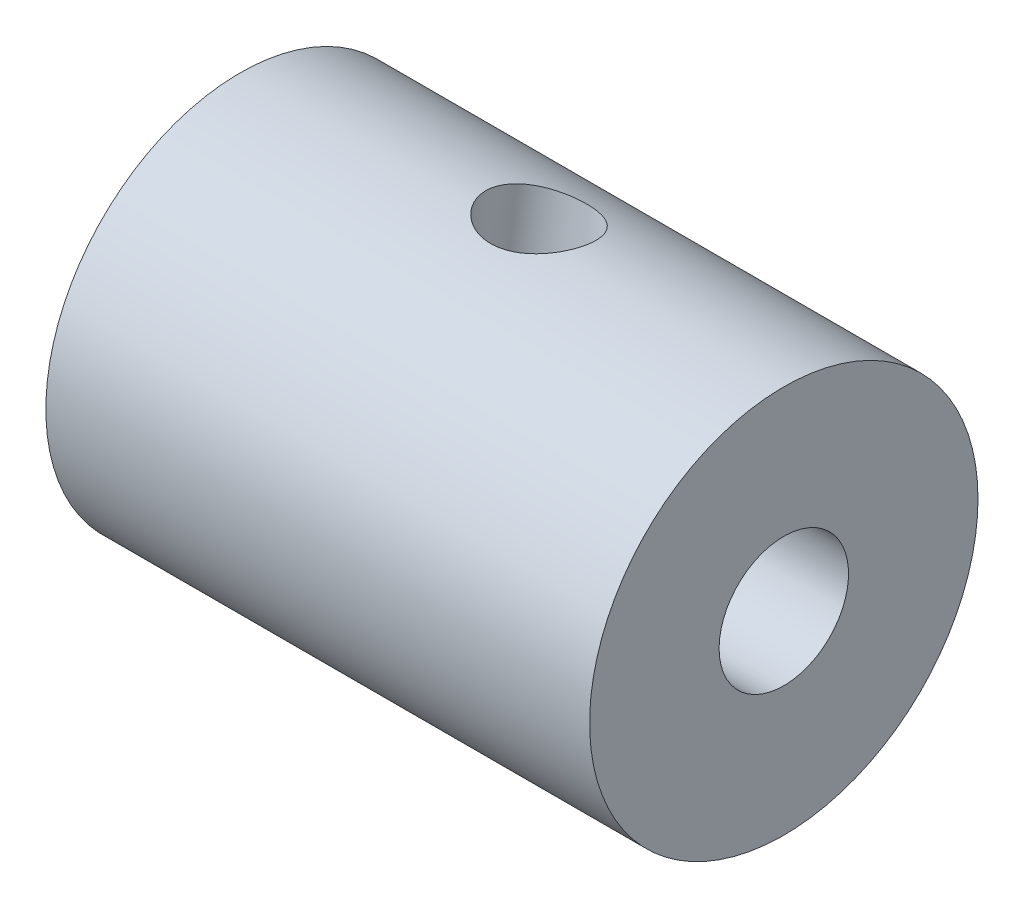
ISO-10303-21;
HEADER;
FILE_DESCRIPTION(('STEP AP214'),'2;1');
FILE_NAME('part.step','',(''),(''),'','','');
FILE_SCHEMA(('AUTOMOTIVE_DESIGN { 1 0 10303 214 1 1 1 1 }'));
ENDSEC;
DATA;
#1=APPLICATION_CONTEXT('core data for automotive mechanical design processes');
#2=APPLICATION_PROTOCOL_DEFINITION('international standard','automotive_design',2000,#1);
#3=PRODUCT_CONTEXT('',#1,'mechanical');
#4=PRODUCT('Part','Part','',(#3));
#5=PRODUCT_RELATED_PRODUCT_CATEGORY('part','',(#4));
#6=PRODUCT_DEFINITION_FORMATION('','',#4);
#7=PRODUCT_DEFINITION_CONTEXT('part definition',#1,'design');
#8=PRODUCT_DEFINITION('design','',#6,#7);
#9=PRODUCT_DEFINITION_SHAPE('','',#8);
#10=(LENGTH_UNIT() NAMED_UNIT(*) SI_UNIT(.MILLI.,.METRE.));
#11=(NAMED_UNIT(*) PLANE_ANGLE_UNIT() SI_UNIT($,.RADIAN.));
#12=(NAMED_UNIT(*) SI_UNIT($,.STERADIAN.) SOLID_ANGLE_UNIT());
#13=UNCERTAINTY_MEASURE_WITH_UNIT(LENGTH_MEASURE(1.E-05),#10,'distance_accuracy_value','');
#14=(GEOMETRIC_REPRESENTATION_CONTEXT(3) GLOBAL_UNCERTAINTY_ASSIGNED_CONTEXT((#13)) GLOBAL_UNIT_ASSIGNED_CONTEXT((#10,
#11,#12)) REPRESENTATION_CONTEXT('',''));
#15=CARTESIAN_POINT('',(0.,0.,0.));
#16=DIRECTION('',(0.,0.,1.));
#17=DIRECTION('',(1.,0.,0.));
#18=AXIS2_PLACEMENT_3D('',#15,#16,#17);
#19=CARTESIAN_POINT('',(-77.7999999999986,709.260912286206,-417.857743681072));
#20=DIRECTION('',(-1.,0.,0.));
#21=DIRECTION('',(0.,0.,1.));
#22=AXIS2_PLACEMENT_3D('',#19,#20,#21);
#23=CYLINDRICAL_SURFACE('',#22,0.999999999999928);
#24=CARTESIAN_POINT('',(-77.7999999999986,709.260912286206,-417.857743681072));
#25=DIRECTION('',(-1.,0.,0.));
#26=DIRECTION('',(0.,0.,1.));
#27=AXIS2_PLACEMENT_3D('',#24,#25,#26);
#28=CIRCLE('',#27,0.999999999999928);
#29=CARTESIAN_POINT('',(-77.7999999999986,709.260912286206,-416.857743681072));
#30=VERTEX_POINT('',#29);
#31=EDGE_CURVE('E70',#30,#30,#28,.T.);
#32=ORIENTED_EDGE('',*,*,#31,.F.);
#33=EDGE_LOOP('',(#32));
#34=FACE_BOUND('',#33,.T.);
#35=CARTESIAN_POINT('',(-81.2499999999986,708.27101270587,-417.715973370885));
#36=CARTESIAN_POINT('',(-81.2500048845507,708.276207997283,-417.679730081788));
#37=CARTESIAN_POINT('',(-81.2527028403196,708.283412885975,-417.64372410393));
#38=CARTESIAN_POINT('',(-81.2633318807978,708.301499896406,-417.573393158187));
#39=CARTESIAN_POINT('',(-81.2712767691582,708.312391680702,-417.539072881622));
#40=CARTESIAN_POINT('',(-81.2918568135323,708.33710976115,-417.473274282663));
#41=CARTESIAN_POINT('',(-81.304463249926,708.350917871078,-417.441779995941));
#42=CARTESIAN_POINT('',(-81.3337717143092,708.380724270285,-417.38194121829));
#43=CARTESIAN_POINT('',(-81.3504723997277,708.396721840846,-417.353595699248));
#44=CARTESIAN_POINT('',(-81.3891314254881,708.431673143965,-417.297793605723));
#45=CARTESIAN_POINT('',(-81.4114334597181,708.45076344167,-417.270662515316));
#46=CARTESIAN_POINT('',(-81.4597476714206,708.489636242297,-417.220449361895));
#47=CARTESIAN_POINT('',(-81.4857656108342,708.509419783533,-417.197373713631));
#48=CARTESIAN_POINT('',(-81.5467915096183,708.552597477789,-417.151001440495));
#49=CARTESIAN_POINT('',(-81.5825519064802,708.575908306867,-417.128612987354));
#50=CARTESIAN_POINT('',(-81.6587255820783,708.619753626098,-417.089779633551));
#51=CARTESIAN_POINT('',(-81.699132388585,708.640291893588,-417.073326594281));
#52=CARTESIAN_POINT('',(-81.7697514249272,708.669376807342,-417.051333288142));
#53=CARTESIAN_POINT('',(-81.79869536009,708.679618924349,-417.043985869656));
#54=CARTESIAN_POINT('',(-81.8581963795789,708.696380139565,-417.032268775681));
#55=CARTESIAN_POINT('',(-81.8887495951812,708.702907757833,-417.027892281203));
#56=CARTESIAN_POINT('',(-81.9510912641388,708.711280253198,-417.022319939194));
#57=CARTESIAN_POINT('',(-81.9828883451079,708.713082559864,-417.021153002059));
#58=CARTESIAN_POINT('',(-82.0463073975172,708.711524256042,-417.022176115647));
#59=CARTESIAN_POINT('',(-82.0779293017384,708.708161785143,-417.02436737603));
#60=CARTESIAN_POINT('',(-82.1365957174613,708.697515196412,-417.031536976128));
#61=CARTESIAN_POINT('',(-82.1637682712989,708.690688553605,-417.03619245829));
#62=CARTESIAN_POINT('',(-82.216719520876,708.674232837157,-417.047861474921));
#63=CARTESIAN_POINT('',(-82.2424968536256,708.664601079775,-417.054877268577));
#64=CARTESIAN_POINT('',(-82.3081283443234,708.63669974189,-417.076189582305));
#65=CARTESIAN_POINT('',(-82.3467004939664,708.616795944951,-417.092295127816));
#66=CARTESIAN_POINT('',(-82.4195985205639,708.574486562594,-417.129988351715));
#67=CARTESIAN_POINT('',(-82.4539137989757,708.552074986977,-417.151589320361));
#68=CARTESIAN_POINT('',(-82.5188742353395,708.506160493196,-417.200847149261));
#69=CARTESIAN_POINT('',(-82.5494057164576,708.482644301465,-417.228642346256));
#70=CARTESIAN_POINT('',(-82.6051280733627,708.436845520409,-417.289964334865));
#71=CARTESIAN_POINT('',(-82.6303283864811,708.414560803674,-417.323480805203));
#72=CARTESIAN_POINT('',(-82.6699986312418,708.377067693497,-417.388766391233));
#73=CARTESIAN_POINT('',(-82.6856067770826,708.361335854256,-417.419541595384));
#74=CARTESIAN_POINT('',(-82.7121230026604,708.332617442938,-417.484227453326));
#75=CARTESIAN_POINT('',(-82.7230384110854,708.319626606491,-417.518133116901));
#76=CARTESIAN_POINT('',(-82.7374579930122,708.300057549694,-417.579333934648));
#77=CARTESIAN_POINT('',(-82.7421434608892,708.292688986344,-417.606103039053));
#78=CARTESIAN_POINT('',(-82.7484153705992,708.28015788407,-417.660512496051));
#79=CARTESIAN_POINT('',(-82.7500016622642,708.274995452052,-417.688152890795));
#80=CARTESIAN_POINT('',(-82.7499978315725,708.265817212014,-417.752265197374));
#81=CARTESIAN_POINT('',(-82.7472934082658,708.262629214563,-417.788863478914));
#82=CARTESIAN_POINT('',(-82.7366544341147,708.260258086652,-417.861433438673));
#83=CARTESIAN_POINT('',(-82.7287146197777,708.261078991941,-417.897404448858));
#84=CARTESIAN_POINT('',(-82.7081452962362,708.266331987111,-417.967463110696));
#85=CARTESIAN_POINT('',(-82.6955415131832,708.270744423588,-418.001559936824));
#86=CARTESIAN_POINT('',(-82.6662344673994,708.282556401723,-418.067359536654));
#87=CARTESIAN_POINT('',(-82.6495310211331,708.289956077125,-418.099062203091));
#88=CARTESIAN_POINT('',(-82.6108678261683,708.307841970999,-418.162438317533));
#89=CARTESIAN_POINT('',(-82.5885648827799,708.318550306374,-418.193838063676));
#90=CARTESIAN_POINT('',(-82.5402502957325,708.341766981028,-418.252943106282));
#91=CARTESIAN_POINT('',(-82.5142331701942,708.354277981177,-418.280642822657));
#92=CARTESIAN_POINT('',(-82.4532117660105,708.382702555651,-418.337266229201));
#93=CARTESIAN_POINT('',(-82.4174554953008,708.398791010154,-418.365295256726));
#94=CARTESIAN_POINT('',(-82.3412811344146,708.429974081354,-418.414874970212));
#95=CARTESIAN_POINT('',(-82.3008686515711,708.445069859775,-418.436433338043));
#96=CARTESIAN_POINT('',(-82.2299734980261,708.466900223156,-418.465823093375));
#97=CARTESIAN_POINT('',(-82.2007376052727,708.474737748683,-418.475831946807));
#98=CARTESIAN_POINT('',(-82.1406402028206,708.487597866375,-418.491851157142));
#99=CARTESIAN_POINT('',(-82.1097850732087,708.492630714189,-418.497876097004));
#100=CARTESIAN_POINT('',(-82.0655214327794,708.497138113137,-418.503229973255));
#101=CARTESIAN_POINT('',(-82.0524693465091,708.498141842945,-418.504414123985));
#102=CARTESIAN_POINT('',(-82.0262810227931,708.499488212035,-418.505998362604));
#103=CARTESIAN_POINT('',(-82.0131447630282,708.499830668025,-418.506398233107));
#104=CARTESIAN_POINT('',(-81.9650341732786,708.499819165988,-418.506390500157));
#105=CARTESIAN_POINT('',(-81.9300081782554,708.497365383375,-418.503540483813));
#106=CARTESIAN_POINT('',(-81.8613543700137,708.488170402613,-418.49250016541));
#107=CARTESIAN_POINT('',(-81.8277322412017,708.481413293182,-418.484290041845));
#108=CARTESIAN_POINT('',(-81.7632095114858,708.465125445836,-418.463461345449));
#109=CARTESIAN_POINT('',(-81.732277226604,708.455635150856,-418.450906550532));
#110=CARTESIAN_POINT('',(-81.6728234327272,708.435139488555,-418.422024596851));
#111=CARTESIAN_POINT('',(-81.6443013420605,708.424134488486,-418.405698351853));
#112=CARTESIAN_POINT('',(-81.5839430764651,708.39927799166,-418.365921497186));
#113=CARTESIAN_POINT('',(-81.5526648176567,708.385313242696,-418.341694883806));
#114=CARTESIAN_POINT('',(-81.4937361291908,708.358080162472,-418.288769305694));
#115=CARTESIAN_POINT('',(-81.4660910010762,708.344812865509,-418.260063936081));
#116=CARTESIAN_POINT('',(-81.4095775010856,708.317659195234,-418.192209657688));
#117=CARTESIAN_POINT('',(-81.3816094302927,708.304198358577,-418.152124789363));
#118=CARTESIAN_POINT('',(-81.3326983488309,708.281995756834,-418.066686304748));
#119=CARTESIAN_POINT('',(-81.3117418987073,708.273244944021,-418.021342994903));
#120=CARTESIAN_POINT('',(-81.283387951575,708.263840174564,-417.941145563671));
#121=CARTESIAN_POINT('',(-81.2738076237142,708.261541108672,-417.907247034778));
#122=CARTESIAN_POINT('',(-81.25930445421,708.260511919089,-417.838469828234));
#123=CARTESIAN_POINT('',(-81.2543676684105,708.261771064499,-417.803594411024));
#124=CARTESIAN_POINT('',(-81.2506269369177,708.2664518331,-417.751134776349));
#125=CARTESIAN_POINT('',(-81.2499976343768,708.268496590864,-417.733526242575));
#126=CARTESIAN_POINT('',(-81.2499999999986,708.27101270587,-417.715973370885));
#127=B_SPLINE_CURVE_WITH_KNOTS('',3,(#35,#36,#37,#38,#39,#40,#41,#42,#43,#44,#45,#46,#47,#48,
#49,#50,#51,#52,#53,#54,#55,#56,#57,#58,#59,#60,#61,#62,#63,#64,#65,#66,#67,#68,#69,#70,#71,#72,
#73,#74,#75,#76,#77,#78,#79,#80,#81,#82,#83,#84,#85,#86,#87,#88,#89,#90,#91,#92,#93,#94,#95,#96,
#97,#98,#99,#100,#101,#102,#103,#104,#105,#106,#107,#108,#109,#110,#111,#112,#113,#114,#115,
#116,#117,#118,#119,#120,#121,#122,#123,#124,#125,#126),.UNSPECIFIED.,.T.,.F.,(4,2,2,2,2,2,2,2,
2,2,2,2,2,2,2,2,2,2,2,2,2,2,2,2,2,2,2,2,2,2,2,2,2,2,2,2,2,2,2,2,2,2,2,2,2,4),(0.,
0.10977909861095,0.219848161168952,0.329250094068512,0.438616200162933,0.558111599137529,
0.677794342893345,0.821800215780328,0.965607871232492,1.05999761233454,1.15416996693877,
1.24918785242927,1.34423997247256,1.42913458582805,1.51411068885052,1.65224717459528,
1.7907209623771,1.93266884602551,2.07436330844395,2.18768580001658,2.30083066627396,
2.38504944966747,2.46927231371258,2.57914107077497,2.68912045508973,2.79850202951172,
2.9078885016643,3.0273884559494,3.14706664334592,3.29105921757442,3.43488016359609,
3.53020422074185,3.62517738737275,3.66457445599727,3.70398244311206,3.80880995850965,
3.91402733535224,4.01776145273725,4.12147046320083,4.24691101470579,4.3725326260611,
4.52377308917047,4.67472198031441,4.7801931746735,4.88534662738972,4.9385133923331),.UNSPECIFIED.);
#128=CARTESIAN_POINT('',(-81.2499999999986,708.27101270587,-417.715973370885));
#129=VERTEX_POINT('',#128);
#130=EDGE_CURVE('E19',#129,#129,#127,.T.);
#131=ORIENTED_EDGE('',*,*,#130,.T.);
#132=EDGE_LOOP('',(#131));
#133=FACE_BOUND('',#132,.T.);
#134=CARTESIAN_POINT('',(-86.1999999999986,709.260912286206,-417.857743681072));
#135=DIRECTION('',(-1.,0.,0.));
#136=DIRECTION('',(0.,0.,1.));
#137=AXIS2_PLACEMENT_3D('',#134,#135,#136);
#138=CIRCLE('',#137,0.999999999999928);
#139=CARTESIAN_POINT('',(-86.1999999999986,709.260912286206,-416.857743681072));
#140=VERTEX_POINT('',#139);
#141=EDGE_CURVE('E54',#140,#140,#138,.F.);
#142=ORIENTED_EDGE('',*,*,#141,.F.);
#143=EDGE_LOOP('',(#142));
#144=FACE_BOUND('',#143,.T.);
#145=CARTESIAN_POINT('',(-81.9999999999987,709.80934158169,-418.693940612335));
#146=CARTESIAN_POINT('',(-82.0349658267189,709.80935118256,-418.693937564401));
#147=CARTESIAN_POINT('',(-82.0699918217421,709.812506262199,-418.6918908317));
#148=CARTESIAN_POINT('',(-82.1386456299838,709.824430387009,-418.683875125296));
#149=CARTESIAN_POINT('',(-82.1722677587958,709.833220267302,-418.677891592791));
#150=CARTESIAN_POINT('',(-82.2367904885117,709.854699512223,-418.662471780782));
#151=CARTESIAN_POINT('',(-82.2677227733935,709.867332158648,-418.65308536408));
#152=CARTESIAN_POINT('',(-82.3271765672703,709.895110436296,-418.631117052526));
#153=CARTESIAN_POINT('',(-82.3556986579369,709.910255458556,-418.61853593163));
#154=CARTESIAN_POINT('',(-82.4160569235324,709.945277220769,-418.58733465324));
#155=CARTESIAN_POINT('',(-82.4473351823409,709.965480466649,-418.568001472814));
#156=CARTESIAN_POINT('',(-82.5062638708068,710.006473820058,-418.524847070336));
#157=CARTESIAN_POINT('',(-82.5339089989214,710.027264732567,-418.50101941056));
#158=CARTESIAN_POINT('',(-82.5904224989118,710.072372007063,-418.44351411782));
#159=CARTESIAN_POINT('',(-82.6183905697048,710.096542640041,-418.408818710435));
#160=CARTESIAN_POINT('',(-82.6673016511665,710.141833344982,-418.333046405314));
#161=CARTESIAN_POINT('',(-82.6882581012901,710.162959208195,-418.291981939214));
#162=CARTESIAN_POINT('',(-82.7166120484223,710.194495481744,-418.21764795563));
#163=CARTESIAN_POINT('',(-82.7261923762831,710.206216659227,-418.185757361978));
#164=CARTESIAN_POINT('',(-82.7406955457874,710.226508640011,-418.120033706518));
#165=CARTESIAN_POINT('',(-82.7456323315868,710.235088827725,-418.086206786002));
#166=CARTESIAN_POINT('',(-82.7493730630796,710.245320414284,-418.03454212205));
#167=CARTESIAN_POINT('',(-82.7500023656205,710.248300156835,-418.017067493862));
#168=CARTESIAN_POINT('',(-82.7499951154467,710.255998061863,-417.963269399448));
#169=CARTESIAN_POINT('',(-82.7472971596778,710.259188833231,-417.926688532309));
#170=CARTESIAN_POINT('',(-82.7366681191997,710.261569138616,-417.854108121579));
#171=CARTESIAN_POINT('',(-82.7287232308392,710.260748081742,-417.818110368674));
#172=CARTESIAN_POINT('',(-82.7081431864652,710.255491746162,-417.748018927954));
#173=CARTESIAN_POINT('',(-82.6955367500716,710.25107840345,-417.713915021989));
#174=CARTESIAN_POINT('',(-82.6662282856885,710.239265504303,-417.648115659088));
#175=CARTESIAN_POINT('',(-82.64952760027,710.231866926261,-417.616419417094));
#176=CARTESIAN_POINT('',(-82.6108685745097,710.21398293286,-417.553050418273));
#177=CARTESIAN_POINT('',(-82.5885665402797,710.20327508614,-417.52165173117));
#178=CARTESIAN_POINT('',(-82.5402523285773,710.180058544688,-417.462546337101));
#179=CARTESIAN_POINT('',(-82.5142343891638,710.167547052908,-417.434845495596));
#180=CARTESIAN_POINT('',(-82.4532084903797,710.139120618638,-417.378218303968));
#181=CARTESIAN_POINT('',(-82.4174480935179,710.123030747981,-417.350187006306));
#182=CARTESIAN_POINT('',(-82.3412744179199,710.091847526374,-417.30060830043));
#183=CARTESIAN_POINT('',(-82.3008676114133,710.076752834245,-417.27905202055));
#184=CARTESIAN_POINT('',(-82.2302485750711,710.055010074928,-417.249779334643));
#185=CARTESIAN_POINT('',(-82.2013046399082,710.047241916346,-417.239852541029));
#186=CARTESIAN_POINT('',(-82.1418036204193,710.034443178206,-417.223901963335));
#187=CARTESIAN_POINT('',(-82.1112504048171,710.029406335006,-417.217869242992));
#188=CARTESIAN_POINT('',(-82.0489087358594,710.022934421005,-417.210170931276));
#189=CARTESIAN_POINT('',(-82.0171116548903,710.021532094929,-417.2085450367));
#190=CARTESIAN_POINT('',(-81.9536926024809,710.022740594424,-417.209964403173));
#191=CARTESIAN_POINT('',(-81.9220706982597,710.0253528661,-417.213011347431));
#192=CARTESIAN_POINT('',(-81.8634042825367,710.03355914708,-417.222880996342));
#193=CARTESIAN_POINT('',(-81.836231728699,710.038804689385,-417.229265418956));
#194=CARTESIAN_POINT('',(-81.7832804791219,710.051323703279,-417.245084105503));
#195=CARTESIAN_POINT('',(-81.7575031463724,710.058599116629,-417.254521291072));
#196=CARTESIAN_POINT('',(-81.6918716556746,710.079397015768,-417.282808156639));
#197=CARTESIAN_POINT('',(-81.6532995060315,710.093980274981,-417.303852830063));
#198=CARTESIAN_POINT('',(-81.5804014794341,710.124009308699,-417.351906134811));
#199=CARTESIAN_POINT('',(-81.5460862010222,710.139457102345,-417.378929203467));
#200=CARTESIAN_POINT('',(-81.4811257646585,710.169700414866,-417.439094114294));
#201=CARTESIAN_POINT('',(-81.4505942835403,710.184469845836,-417.472372457978));
#202=CARTESIAN_POINT('',(-81.3948719266352,710.211215967979,-417.544084099874));
#203=CARTESIAN_POINT('',(-81.3696716135168,710.223197597988,-417.582508088816));
#204=CARTESIAN_POINT('',(-81.330001368756,710.240859428028,-417.65569279223));
#205=CARTESIAN_POINT('',(-81.3143932229151,710.247321000422,-417.689646467121));
#206=CARTESIAN_POINT('',(-81.2878769973372,710.256729183529,-417.75979269622));
#207=CARTESIAN_POINT('',(-81.2769615889122,710.25968128783,-417.795981657718));
#208=CARTESIAN_POINT('',(-81.2625420069852,710.261286068614,-417.86021492601));
#209=CARTESIAN_POINT('',(-81.2578565391082,710.260844968108,-417.887976159896));
#210=CARTESIAN_POINT('',(-81.2515846293981,710.257600880547,-417.943715673985));
#211=CARTESIAN_POINT('',(-81.2499983377331,710.254797779052,-417.971693964641));
#212=CARTESIAN_POINT('',(-81.2500021684249,710.24561224221,-418.035805226194));
#213=CARTESIAN_POINT('',(-81.2527065917316,710.238399803289,-418.071827139861));
#214=CARTESIAN_POINT('',(-81.2633455658827,710.22030691764,-418.142145478835));
#215=CARTESIAN_POINT('',(-81.2712853802198,710.209422784895,-418.176440130219));
#216=CARTESIAN_POINT('',(-81.2918547037614,710.184717110851,-418.242208205506));
#217=CARTESIAN_POINT('',(-81.3044584868143,710.170911857875,-418.273695951343));
#218=CARTESIAN_POINT('',(-81.3337655325983,710.141106276157,-418.333535214905));
#219=CARTESIAN_POINT('',(-81.3504689788646,710.125105849156,-418.361886592139));
#220=CARTESIAN_POINT('',(-81.3891321738294,710.090150724769,-418.417694981836));
#221=CARTESIAN_POINT('',(-81.4114351172179,710.071059660804,-418.444826951557));
#222=CARTESIAN_POINT('',(-81.4597497042654,710.032186830976,-418.495039730257));
#223=CARTESIAN_POINT('',(-81.4857668298037,710.012404077407,-418.518114436608));
#224=CARTESIAN_POINT('',(-81.5467882339875,709.969229230573,-418.564483598813));
#225=CARTESIAN_POINT('',(-81.5825445046973,709.945920397897,-418.586870270553));
#226=CARTESIAN_POINT('',(-81.6587188655836,709.902074940214,-418.625704633678));
#227=CARTESIAN_POINT('',(-81.6991313484272,709.881535044058,-418.642159372072));
#228=CARTESIAN_POINT('',(-81.7700265019722,709.852333189054,-418.664240453298));
#229=CARTESIAN_POINT('',(-81.7992623947257,709.842001461206,-418.671647163302));
#230=CARTESIAN_POINT('',(-81.8593597971777,709.825162070166,-418.683412903236));
#231=CARTESIAN_POINT('',(-81.8902149267895,709.818640470479,-418.687783051401));
#232=CARTESIAN_POINT('',(-81.9344785672187,709.812811549801,-418.691656592404));
#233=CARTESIAN_POINT('',(-81.9475306534889,709.811515803995,-418.692511419456));
#234=CARTESIAN_POINT('',(-81.9737189772048,709.809778896835,-418.69365408093));
#235=CARTESIAN_POINT('',(-81.9868552369695,709.809337972419,-418.693941758151));
#236=CARTESIAN_POINT('',(-81.9999999999987,709.80934158169,-418.693940612335));
#237=B_SPLINE_CURVE_WITH_KNOTS('',3,(#145,#146,#147,#148,#149,#150,#151,#152,#153,#154,#155,
#156,#157,#158,#159,#160,#161,#162,#163,#164,#165,#166,#167,#168,#169,#170,#171,#172,#173,#174,
#175,#176,#177,#178,#179,#180,#181,#182,#183,#184,#185,#186,#187,#188,#189,#190,#191,#192,#193,
#194,#195,#196,#197,#198,#199,#200,#201,#202,#203,#204,#205,#206,#207,#208,#209,#210,#211,#212,
#213,#214,#215,#216,#217,#218,#219,#220,#221,#222,#223,#224,#225,#226,#227,#228,#229,#230,#231,
#232,#233,#234,#235,#236),.UNSPECIFIED.,.T.,.F.,(4,2,2,2,2,2,2,2,2,2,2,2,2,2,2,2,2,2,2,2,2,2,2,
2,2,2,2,2,2,2,2,2,2,2,2,2,2,2,2,2,2,2,2,2,2,4),(0.,0.104827515397535,0.21004489224005,
0.313779009625065,0.417488020088701,0.542928571593843,0.668550182949094,0.819790646058455,
0.97073953720227,1.07621073156133,1.18136418427751,1.23453094922017,1.34431004783097,
1.45437911038896,1.56378104328848,1.67314714938292,1.79264254835743,1.91232529211317,
2.05633116500008,2.20013882045222,2.29452856155441,2.38870091615867,2.48371880164926,
2.57877092169268,2.66366553504821,2.74864163807062,2.88677812381533,3.02525191159701,
3.16719979524538,3.30889425766379,3.42221674923636,3.53536161549401,3.61958039888825,
3.70380326293407,3.81367201999647,3.9236514043113,4.03303297873331,4.14241945088583,
4.26191940517105,4.38159759256774,4.52559016679625,4.66941111281807,4.76473516996373,
4.85970833659449,4.89910540521868,4.93851339233312),.UNSPECIFIED.);
#238=CARTESIAN_POINT('',(-81.9999999999987,709.80934158169,-418.693940612335));
#239=VERTEX_POINT('',#238);
#240=EDGE_CURVE('E65',#239,#239,#237,.T.);
#241=ORIENTED_EDGE('',*,*,#240,.T.);
#242=EDGE_LOOP('',(#241));
#243=FACE_BOUND('',#242,.T.);
#244=ADVANCED_FACE('F15',(#34,#133,#144,#243),#23,.F.);
#245=CARTESIAN_POINT('',(-81.9999999999987,706.188551002081,-417.417729743387));
#246=DIRECTION('',(0.,0.989899580336078,-0.141770310186783));
#247=DIRECTION('',(0.,0.141770310186783,0.989899580336078));
#248=AXIS2_PLACEMENT_3D('',#245,#246,#247);
#249=CYLINDRICAL_SURFACE('',#248,0.749999999999979);
#250=CARTESIAN_POINT('',(-81.9999999999987,706.279186111771,-418.188362828568));
#251=CARTESIAN_POINT('',(-82.0414272520417,706.279185716028,-418.188362061246));
#252=CARTESIAN_POINT('',(-82.0828622086163,706.278787694996,-418.184827510478));
#253=CARTESIAN_POINT('',(-82.1645288235234,706.27728479915,-418.170817768395));
#254=CARTESIAN_POINT('',(-82.20476032834,706.276179834555,-418.160341695511));
#255=CARTESIAN_POINT('',(-82.2792922132981,706.273641912033,-418.134096704128));
#256=CARTESIAN_POINT('',(-82.3137979806835,706.27224839372,-418.118902198232));
#257=CARTESIAN_POINT('',(-82.3801377331413,706.269367566374,-418.083519403028));
#258=CARTESIAN_POINT('',(-82.4119716413379,706.267880254645,-418.0633309701));
#259=CARTESIAN_POINT('',(-82.4763213142916,706.264953233024,-418.015466650797));
#260=CARTESIAN_POINT('',(-82.5083659608642,706.263546088942,-417.987152401972));
#261=CARTESIAN_POINT('',(-82.567334607976,706.261521110845,-417.925568356241));
#262=CARTESIAN_POINT('',(-82.5942558371405,706.260903702989,-417.892295894574));
#263=CARTESIAN_POINT('',(-82.6422374918772,706.260921049558,-417.821721582112));
#264=CARTESIAN_POINT('',(-82.6632932448471,706.261556799047,-417.784416551508));
#265=CARTESIAN_POINT('',(-82.6988639914202,706.264457210297,-417.70689297275));
#266=CARTESIAN_POINT('',(-82.7133852940268,706.266720295359,-417.666677278585));
#267=CARTESIAN_POINT('',(-82.7328820713023,706.272356049393,-417.594043858255));
#268=CARTESIAN_POINT('',(-82.7392884367597,706.275351129897,-417.561973324736));
#269=CARTESIAN_POINT('',(-82.7478478938913,706.28245616313,-417.497390656318));
#270=CARTESIAN_POINT('',(-82.7500011312827,706.286566077657,-417.464878536588));
#271=CARTESIAN_POINT('',(-82.7499985699585,706.297088343376,-417.391418489891));
#272=CARTESIAN_POINT('',(-82.746554645867,706.303822104587,-417.350510224689));
#273=CARTESIAN_POINT('',(-82.7328889446098,706.318744880082,-417.270098185794));
#274=CARTESIAN_POINT('',(-82.7226623667921,706.32693492209,-417.230595427777));
#275=CARTESIAN_POINT('',(-82.6957801548835,706.344325471881,-417.154140720034));
#276=CARTESIAN_POINT('',(-82.6791326019995,706.353524699168,-417.11718563254));
#277=CARTESIAN_POINT('',(-82.63990864234,706.372391180349,-417.046708218504));
#278=CARTESIAN_POINT('',(-82.6173322104889,706.382058436222,-417.013185906481));
#279=CARTESIAN_POINT('',(-82.5663996733794,706.401415344908,-416.949780238653));
#280=CARTESIAN_POINT('',(-82.5379443656925,706.411102103089,-416.919975681735));
#281=CARTESIAN_POINT('',(-82.4762740767429,706.429624144188,-416.865454214663));
#282=CARTESIAN_POINT('',(-82.4430585332362,706.438459326318,-416.840737906337));
#283=CARTESIAN_POINT('',(-82.3722023557579,706.454722218661,-416.796678753201));
#284=CARTESIAN_POINT('',(-82.3345033196691,706.462127072614,-416.777421180225));
#285=CARTESIAN_POINT('',(-82.2561257242371,706.474733068167,-416.745311681383));
#286=CARTESIAN_POINT('',(-82.2154476475651,706.479934565838,-416.73245872045));
#287=CARTESIAN_POINT('',(-82.1331282850799,706.487584482617,-416.713735767824));
#288=CARTESIAN_POINT('',(-82.091522621847,706.490085968289,-416.707731040378));
#289=CARTESIAN_POINT('',(-82.0078157860766,706.492289664552,-416.702435204214));
#290=CARTESIAN_POINT('',(-81.965714694416,706.491992325878,-416.703143014476));
#291=CARTESIAN_POINT('',(-81.8832922193732,706.488668738536,-416.711147474895));
#292=CARTESIAN_POINT('',(-81.8429524339362,706.485708817713,-416.718283985158));
#293=CARTESIAN_POINT('',(-81.7641197085238,706.477409854328,-416.738710800959));
#294=CARTESIAN_POINT('',(-81.7256269115457,706.472070627883,-416.752001582127));
#295=CARTESIAN_POINT('',(-81.6511297374287,706.459388889712,-416.784536824142));
#296=CARTESIAN_POINT('',(-81.6151545022293,706.452026641743,-416.803840204484));
#297=CARTESIAN_POINT('',(-81.5470384802865,706.435900492081,-416.847864307528));
#298=CARTESIAN_POINT('',(-81.5148981085602,706.427136438921,-416.872585615752));
#299=CARTESIAN_POINT('',(-81.4544043291214,706.408585862155,-416.927636354256));
#300=CARTESIAN_POINT('',(-81.4261840782213,706.39877739871,-416.95810487906));
#301=CARTESIAN_POINT('',(-81.3753983818202,706.379056595207,-417.023435473374));
#302=CARTESIAN_POINT('',(-81.3528353701155,706.369144212345,-417.058299424177));
#303=CARTESIAN_POINT('',(-81.3139563120141,706.349850243332,-417.131683870905));
#304=CARTESIAN_POINT('',(-81.2976668279197,706.340471054421,-417.170219071183));
#305=CARTESIAN_POINT('',(-81.2720228750061,706.322891636671,-417.249728087071));
#306=CARTESIAN_POINT('',(-81.262653975756,706.314688983546,-417.290696634846));
#307=CARTESIAN_POINT('',(-81.2545977242628,706.304348480036,-417.348807362413));
#308=CARTESIAN_POINT('',(-81.2528752299717,706.301531159236,-417.365453435145));
#309=CARTESIAN_POINT('',(-81.2505759430747,706.296166235944,-417.398867701785));
#310=CARTESIAN_POINT('',(-81.2499991385917,706.293618630657,-417.415635894425));
#311=CARTESIAN_POINT('',(-81.2500021011099,706.28534715264,-417.473403000098));
#312=CARTESIAN_POINT('',(-81.253441031353,706.280328683259,-417.514543783152));
#313=CARTESIAN_POINT('',(-81.2670979885756,706.272077976268,-417.595923078009));
#314=CARTESIAN_POINT('',(-81.2773294107915,706.268849291361,-417.636159644214));
#315=CARTESIAN_POINT('',(-81.304224769231,706.264079655884,-417.714458983186));
#316=CARTESIAN_POINT('',(-81.3208790414375,706.262536182994,-417.752524923641));
#317=CARTESIAN_POINT('',(-81.3601103258423,706.260864042364,-417.825465706802));
#318=CARTESIAN_POINT('',(-81.3826827485614,706.260734281605,-417.860342994141));
#319=CARTESIAN_POINT('',(-81.429351127081,706.261450718301,-417.921085591273));
#320=CARTESIAN_POINT('',(-81.452715690692,706.262154009375,-417.947518825127));
#321=CARTESIAN_POINT('',(-81.5028494940508,706.264040374734,-417.996919722805));
#322=CARTESIAN_POINT('',(-81.5296192775528,706.26522352571,-418.019886831865));
#323=CARTESIAN_POINT('',(-81.5913640831453,706.268031891758,-418.065810387039));
#324=CARTESIAN_POINT('',(-81.6269381281424,706.269698399182,-418.087965318981));
#325=CARTESIAN_POINT('',(-81.7012913790003,706.27287221214,-418.126041930521));
#326=CARTESIAN_POINT('',(-81.7400706500216,706.274379514437,-418.141963483361));
#327=CARTESIAN_POINT('',(-81.8154520132536,706.276736810978,-418.165676675507));
#328=CARTESIAN_POINT('',(-81.851835398327,706.277640294497,-418.174161784722));
#329=CARTESIAN_POINT('',(-81.9254771718736,706.278865092613,-418.185504913781));
#330=CARTESIAN_POINT('',(-81.9627354689469,706.27918646775,-418.188363518788));
#331=CARTESIAN_POINT('',(-81.9999999999987,706.279186111771,-418.188362828568));
#332=B_SPLINE_CURVE_WITH_KNOTS('',3,(#250,#251,#252,#253,#254,#255,#256,#257,#258,#259,#260,
#261,#262,#263,#264,#265,#266,#267,#268,#269,#270,#271,#272,#273,#274,#275,#276,#277,#278,#279,
#280,#281,#282,#283,#284,#285,#286,#287,#288,#289,#290,#291,#292,#293,#294,#295,#296,#297,#298,
#299,#300,#301,#302,#303,#304,#305,#306,#307,#308,#309,#310,#311,#312,#313,#314,#315,#316,#317,
#318,#319,#320,#321,#322,#323,#324,#325,#326,#327,#328,#329,#330,#331),.UNSPECIFIED.,.T.,.F.,(4,
2,2,2,2,2,2,2,2,2,2,2,2,2,2,2,2,2,2,2,2,2,2,2,2,2,2,2,2,2,2,2,2,2,2,2,2,2,2,2,4),(0.,
0.124146475776916,0.248308721108648,0.361068657170531,0.473831836490943,0.601573607054029,
0.729384280904793,0.857296483022053,0.985084919691725,1.08332375138461,1.18155921723547,
1.3057372842734,1.43000333645535,1.55411349953879,1.67822418754208,1.80463105516265,
1.93105286535404,2.05935256514715,2.18763152330943,2.31334058789301,2.43902940802345,
2.56167133146979,2.68432273481469,2.80821600521703,2.93212267147203,3.05954130624751,
3.18701466399745,3.31502196476714,3.44276159227518,3.49363997883889,3.54451783795843,
3.66861716796635,3.7929619598019,3.91712038402388,4.04118280769938,4.14671102933245,
4.25225612318573,4.37749371566161,4.50273385478165,4.61441737677983,4.7260892829146),.UNSPECIFIED.);
#333=CARTESIAN_POINT('',(-81.9999999999987,706.279186111771,-418.188362828568));
#334=VERTEX_POINT('',#333);
#335=EDGE_CURVE('E48',#334,#334,#332,.T.);
#336=ORIENTED_EDGE('',*,*,#335,.F.);
#337=EDGE_LOOP('',(#336));
#338=FACE_BOUND('',#337,.T.);
#339=ORIENTED_EDGE('',*,*,#130,.F.);
#340=EDGE_LOOP('',(#339));
#341=FACE_BOUND('',#340,.T.);
#342=ADVANCED_FACE('F56',(#338,#341),#249,.F.);
#343=CARTESIAN_POINT('',(-77.7999999999986,709.260912286206,-417.857743681072));
#344=DIRECTION('',(1.,0.,0.));
#345=DIRECTION('',(0.,0.,-1.));
#346=AXIS2_PLACEMENT_3D('',#343,#344,#345);
#347=PLANE('',#346);
#348=ORIENTED_EDGE('',*,*,#31,.T.);
#349=EDGE_LOOP('',(#348));
#350=FACE_BOUND('',#349,.T.);
#351=CARTESIAN_POINT('',(-77.7999999999986,709.260912286206,-417.857743681072));
#352=DIRECTION('',(1.,0.,0.));
#353=DIRECTION('',(0.,0.,-1.));
#354=AXIS2_PLACEMENT_3D('',#351,#352,#353);
#355=CIRCLE('',#354,3.);
#356=CARTESIAN_POINT('',(-77.7999999999986,709.260912286206,-420.857743681072));
#357=VERTEX_POINT('',#356);
#358=EDGE_CURVE('E31',#357,#357,#355,.F.);
#359=ORIENTED_EDGE('',*,*,#358,.F.);
#360=EDGE_LOOP('',(#359));
#361=FACE_BOUND('',#360,.T.);
#362=ADVANCED_FACE('F60',(#350,#361),#347,.T.);
#363=CARTESIAN_POINT('',(-86.1999999999986,709.260912286206,-417.857743681072));
#364=DIRECTION('',(-1.,0.,0.));
#365=DIRECTION('',(0.,0.,1.));
#366=AXIS2_PLACEMENT_3D('',#363,#364,#365);
#367=PLANE('',#366);
#368=ORIENTED_EDGE('',*,*,#141,.T.);
#369=EDGE_LOOP('',(#368));
#370=FACE_BOUND('',#369,.T.);
#371=CARTESIAN_POINT('',(-86.1999999999986,709.260912286206,-417.857743681072));
#372=DIRECTION('',(1.,0.,0.));
#373=DIRECTION('',(0.,0.,-1.));
#374=AXIS2_PLACEMENT_3D('',#371,#372,#373);
#375=CIRCLE('',#374,3.);
#376=CARTESIAN_POINT('',(-86.1999999999986,709.260912286206,-420.857743681072));
#377=VERTEX_POINT('',#376);
#378=EDGE_CURVE('E26',#377,#377,#375,.T.);
#379=ORIENTED_EDGE('',*,*,#378,.F.);
#380=EDGE_LOOP('',(#379));
#381=FACE_BOUND('',#380,.T.);
#382=ADVANCED_FACE('F77',(#370,#381),#367,.T.);
#383=CARTESIAN_POINT('',(-81.9999999999987,709.817756522112,-417.937493164371));
#384=DIRECTION('',(-1.15055241638528E-13,0.989899580336038,-0.141770310187063));
#385=DIRECTION('',(0.,0.141770310187063,0.989899580336038));
#386=AXIS2_PLACEMENT_3D('',#383,#384,#385);
#387=CYLINDRICAL_SURFACE('',#386,0.750000000000011);
#388=CARTESIAN_POINT('',(-82.4421426366294,712.255316681472,-417.674598062467));
#389=CARTESIAN_POINT('',(-82.4763116558762,712.256870965667,-417.700014107041));
#390=CARTESIAN_POINT('',(-82.5083543811248,712.258277991545,-417.728325027501));
#391=CARTESIAN_POINT('',(-82.5673268828319,712.26030329031,-417.789908775964));
#392=CARTESIAN_POINT('',(-82.5942522080161,712.260920879167,-417.823185879206));
#393=CARTESIAN_POINT('',(-82.6422380200972,712.260903514225,-417.893766807563));
#394=CARTESIAN_POINT('',(-82.6632945952126,712.260267727264,-417.931073295568));
#395=CARTESIAN_POINT('',(-82.6988650530811,712.25736721174,-418.008597160282));
#396=CARTESIAN_POINT('',(-82.7133856854279,712.25510416993,-418.048811484043));
#397=CARTESIAN_POINT('',(-82.7328820086193,712.249468536514,-418.121443314684));
#398=CARTESIAN_POINT('',(-82.7392883599581,712.246473476578,-418.153513669426));
#399=CARTESIAN_POINT('',(-82.7478478731655,712.239368456171,-418.218096337967));
#400=CARTESIAN_POINT('',(-82.750001132412,712.235258521229,-418.25060864163));
#401=CARTESIAN_POINT('',(-82.7499985685388,712.224736224808,-418.324068900636));
#402=CARTESIAN_POINT('',(-82.7465546405655,712.218002458239,-418.364977195267));
#403=CARTESIAN_POINT('',(-82.7328889305359,712.203079680763,-418.445389232508));
#404=CARTESIAN_POINT('',(-82.7226623573994,712.194889644181,-418.484891961467));
#405=CARTESIAN_POINT('',(-82.6957801533284,712.177499099589,-418.561346646149));
#406=CARTESIAN_POINT('',(-82.6791325983539,712.168299871245,-418.598301737601));
#407=CARTESIAN_POINT('',(-82.639908637463,712.149433389963,-418.668779150957));
#408=CARTESIAN_POINT('',(-82.6173322077547,712.139766135148,-418.702301459084));
#409=CARTESIAN_POINT('',(-82.5663996761093,712.120409228544,-418.765707120076));
#410=CARTESIAN_POINT('',(-82.5379443717537,712.110722471386,-418.795511674062));
#411=CARTESIAN_POINT('',(-82.4762740838144,712.092200430105,-418.850033142219));
#412=CARTESIAN_POINT('',(-82.4430585369773,712.083365246952,-418.874749453481));
#413=CARTESIAN_POINT('',(-82.3722023540848,712.067102353367,-418.918808609984));
#414=CARTESIAN_POINT('',(-82.3345033161388,712.059697499106,-418.938066183721));
#415=CARTESIAN_POINT('',(-82.256125720433,712.047091503757,-418.970175681964));
#416=CARTESIAN_POINT('',(-82.2154476456229,712.041890006394,-418.983028642137));
#417=CARTESIAN_POINT('',(-82.1331282857751,712.03424008986,-419.001751594162));
#418=CARTESIAN_POINT('',(-82.0915226232634,712.031738604207,-419.007756321562));
#419=CARTESIAN_POINT('',(-82.0078157875085,712.029534907851,-419.013052157954));
#420=CARTESIAN_POINT('',(-81.9657146951252,712.029832246506,-419.012344347737));
#421=CARTESIAN_POINT('',(-81.8832922189923,712.033155833892,-419.004339887212));
#422=CARTESIAN_POINT('',(-81.8429524331815,712.036115754755,-418.997203376853));
#423=CARTESIAN_POINT('',(-81.7641197078034,712.044414718184,-418.976776560937));
#424=CARTESIAN_POINT('',(-81.725626911199,712.049753944588,-418.963485779865));
#425=CARTESIAN_POINT('',(-81.6511297380667,712.062435682591,-418.930950538281));
#426=CARTESIAN_POINT('',(-81.6151545034554,712.069797930418,-418.911647158319));
#427=CARTESIAN_POINT('',(-81.5470384813834,712.085924080032,-418.867623055459));
#428=CARTESIAN_POINT('',(-81.5148981090701,712.094688133335,-418.842901746857));
#429=CARTESIAN_POINT('',(-81.4544043276988,712.113238710693,-418.787851006593));
#430=CARTESIAN_POINT('',(-81.4261840756012,712.123047174613,-418.757382480253));
#431=CARTESIAN_POINT('',(-81.3753983797226,712.142767978126,-418.692051885531));
#432=CARTESIAN_POINT('',(-81.3528353692132,712.152680360515,-418.657187936261));
#433=CARTESIAN_POINT('',(-81.3139563140352,712.171974328077,-418.583803495055));
#434=CARTESIAN_POINT('',(-81.2976668313015,712.181353516045,-418.54526829897));
#435=CARTESIAN_POINT('',(-81.2720228769593,712.198932934031,-418.465759283593));
#436=CARTESIAN_POINT('',(-81.2626539763482,712.207135588097,-418.424790731616));
#437=CARTESIAN_POINT('',(-81.2545977239438,712.217476092789,-418.36667999741));
#438=CARTESIAN_POINT('',(-81.2528752294971,712.220293413967,-418.350033922331));
#439=CARTESIAN_POINT('',(-81.250575942905,712.225658337182,-418.316619655658));
#440=CARTESIAN_POINT('',(-81.2499991385616,712.228205942091,-418.299851465366));
#441=CARTESIAN_POINT('',(-81.2500021011847,712.236477420611,-418.242084356203));
#442=CARTESIAN_POINT('',(-81.2534410327946,712.241495890606,-418.20094356723));
#443=CARTESIAN_POINT('',(-81.2670979910403,712.249746597049,-418.119564272639));
#444=CARTESIAN_POINT('',(-81.2773294109781,712.252975281307,-418.079327712339));
#445=CARTESIAN_POINT('',(-81.3042246974167,712.25774490357,-418.001028593067));
#446=CARTESIAN_POINT('',(-81.3208788656016,712.259288372844,-417.962962855167));
#447=CARTESIAN_POINT('',(-81.3601100706829,712.260960528249,-417.890022040074));
#448=CARTESIAN_POINT('',(-81.3826825830861,712.261090291928,-417.855144552858));
#449=CARTESIAN_POINT('',(-81.4293518768301,712.260373843809,-417.794400820976));
#450=CARTESIAN_POINT('',(-81.4527173537155,712.259670518271,-417.767966732492));
#451=CARTESIAN_POINT('',(-81.5028512351953,712.257784114333,-417.718566089499));
#452=CARTESIAN_POINT('',(-81.5296199531521,712.256600991732,-417.69559985473));
#453=CARTESIAN_POINT('',(-81.5913584471079,712.253792965761,-417.649681372306));
#454=CARTESIAN_POINT('',(-81.6269268084181,712.252126821999,-417.627529759655));
#455=CARTESIAN_POINT('',(-81.7012761186302,712.24895284612,-417.589451327199));
#456=CARTESIAN_POINT('',(-81.7400582725807,712.247445073871,-417.573526855249));
#457=CARTESIAN_POINT('',(-81.8198149419023,712.244951697147,-417.548439130621));
#458=CARTESIAN_POINT('',(-81.8607914737605,712.24396658235,-417.539282215314));
#459=CARTESIAN_POINT('',(-81.9437168332268,712.242751644783,-417.52809736897));
#460=CARTESIAN_POINT('',(-81.9856655490676,712.242521735621,-417.526068622494));
#461=CARTESIAN_POINT('',(-82.0684907053954,712.242866389632,-417.529184099135));
#462=CARTESIAN_POINT('',(-82.1093724070791,712.243425799028,-417.53419319803));
#463=CARTESIAN_POINT('',(-82.1896955688988,712.245196656252,-417.550958509297));
#464=CARTESIAN_POINT('',(-82.2291377295123,712.246407782314,-417.562711392318));
#465=CARTESIAN_POINT('',(-82.2984585217494,712.248946068763,-417.5897868788));
#466=CARTESIAN_POINT('',(-82.3287589880282,712.250210592042,-417.60405077331));
#467=CARTESIAN_POINT('',(-82.3871906262065,712.252785879951,-417.636481108544));
#468=CARTESIAN_POINT('',(-82.4153216847567,712.254096646993,-417.654647752995));
#469=CARTESIAN_POINT('',(-82.4421426366294,712.255316681472,-417.674598062467));
#470=B_SPLINE_CURVE_WITH_KNOTS('',3,(#388,#389,#390,#391,#392,#393,#394,#395,#396,#397,#398,
#399,#400,#401,#402,#403,#404,#405,#406,#407,#408,#409,#410,#411,#412,#413,#414,#415,#416,#417,
#418,#419,#420,#421,#422,#423,#424,#425,#426,#427,#428,#429,#430,#431,#432,#433,#434,#435,#436,
#437,#438,#439,#440,#441,#442,#443,#444,#445,#446,#447,#448,#449,#450,#451,#452,#453,#454,#455,
#456,#457,#458,#459,#460,#461,#462,#463,#464,#465,#466,#467,#468,#469),.UNSPECIFIED.,.T.,.F.,(4,
2,2,2,2,2,2,2,2,2,2,2,2,2,2,2,2,2,2,2,2,2,2,2,2,2,2,2,2,2,2,2,2,2,2,2,2,2,2,2,4),(0.,
0.127720925968083,0.255552444172622,0.383468965071894,0.51125308324958,0.609491356652624,
0.70772738078456,0.831905535541932,0.956171500001093,1.08028167652235,1.20439235108692,
1.33079920529504,1.45722102889877,1.58552073467334,1.7137996868546,1.83950874930842,
1.96519757156863,2.0878394961592,2.2104908983598,2.33438416665744,2.4582908350173,
2.5857094756926,2.71318282754298,2.84119011506627,2.96892975581992,3.01980814951156,
3.07068600150476,3.1947853492023,3.31913012334753,3.44328786808863,3.56735097129153,
3.67288276695404,3.77842428678419,3.90363956916595,4.02890201676985,4.15428161628493,
4.27964687232301,4.40263778218826,4.52556802462637,4.62581725713027,4.72607172401405),.UNSPECIFIED.);
#471=CARTESIAN_POINT('',(-82.4421426366294,712.255316681472,-417.674598062467));
#472=VERTEX_POINT('',#471);
#473=EDGE_CURVE('E10',#472,#472,#470,.T.);
#474=ORIENTED_EDGE('',*,*,#473,.F.);
#475=EDGE_LOOP('',(#474));
#476=FACE_BOUND('',#475,.T.);
#477=ORIENTED_EDGE('',*,*,#240,.F.);
#478=EDGE_LOOP('',(#477));
#479=FACE_BOUND('',#478,.T.);
#480=ADVANCED_FACE('F39',(#476,#479),#387,.F.);
#481=CARTESIAN_POINT('',(-82.9999999999987,709.260912286206,-417.857743681072));
#482=DIRECTION('',(1.,0.,0.));
#483=DIRECTION('',(0.,0.,-1.));
#484=AXIS2_PLACEMENT_3D('',#481,#482,#483);
#485=CYLINDRICAL_SURFACE('',#484,3.);
#486=ORIENTED_EDGE('',*,*,#358,.T.);
#487=EDGE_LOOP('',(#486));
#488=FACE_BOUND('',#487,.T.);
#489=ORIENTED_EDGE('',*,*,#335,.T.);
#490=EDGE_LOOP('',(#489));
#491=FACE_BOUND('',#490,.T.);
#492=ORIENTED_EDGE('',*,*,#378,.T.);
#493=EDGE_LOOP('',(#492));
#494=FACE_BOUND('',#493,.T.);
#495=ORIENTED_EDGE('',*,*,#473,.T.);
#496=EDGE_LOOP('',(#495));
#497=FACE_BOUND('',#496,.T.);
#498=ADVANCED_FACE('F42',(#488,#491,#494,#497),#485,.T.);
#499=CLOSED_SHELL('',(#244,#342,#362,#382,#480,#498));
#500=MANIFOLD_SOLID_BREP('B1',#499);
#501=ADVANCED_BREP_SHAPE_REPRESENTATION('',(#18,#500),#14);
#502=SHAPE_DEFINITION_REPRESENTATION(#9,#501);
ENDSEC;
END-ISO-10303-21;
